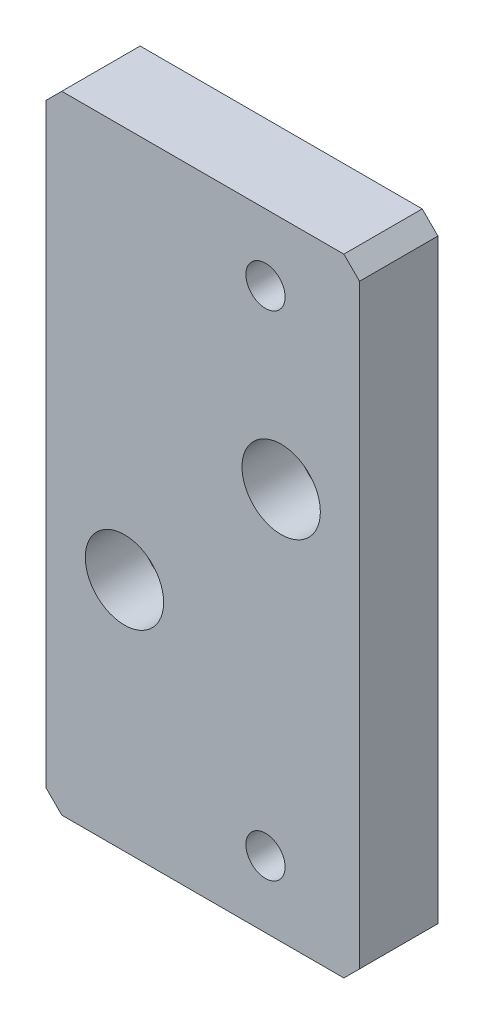
ISO-10303-21;
HEADER;
FILE_DESCRIPTION(('STEP AP214'),'2;1');
FILE_NAME('part.step','',(''),(''),'','','');
FILE_SCHEMA(('AUTOMOTIVE_DESIGN { 1 0 10303 214 1 1 1 1 }'));
ENDSEC;
DATA;
#1=APPLICATION_CONTEXT('core data for automotive mechanical design processes');
#2=APPLICATION_PROTOCOL_DEFINITION('international standard','automotive_design',2000,#1);
#3=PRODUCT_CONTEXT('',#1,'mechanical');
#4=PRODUCT('Part','Part','',(#3));
#5=PRODUCT_RELATED_PRODUCT_CATEGORY('part','',(#4));
#6=PRODUCT_DEFINITION_FORMATION('','',#4);
#7=PRODUCT_DEFINITION_CONTEXT('part definition',#1,'design');
#8=PRODUCT_DEFINITION('design','',#6,#7);
#9=PRODUCT_DEFINITION_SHAPE('','',#8);
#10=(LENGTH_UNIT() NAMED_UNIT(*) SI_UNIT(.MILLI.,.METRE.));
#11=(NAMED_UNIT(*) PLANE_ANGLE_UNIT() SI_UNIT($,.RADIAN.));
#12=(NAMED_UNIT(*) SI_UNIT($,.STERADIAN.) SOLID_ANGLE_UNIT());
#13=UNCERTAINTY_MEASURE_WITH_UNIT(LENGTH_MEASURE(1.E-05),#10,'distance_accuracy_value','');
#14=(GEOMETRIC_REPRESENTATION_CONTEXT(3) GLOBAL_UNCERTAINTY_ASSIGNED_CONTEXT((#13)) GLOBAL_UNIT_ASSIGNED_CONTEXT((#10,
#11,#12)) REPRESENTATION_CONTEXT('',''));
#15=CARTESIAN_POINT('',(0.,0.,0.));
#16=DIRECTION('',(0.,0.,1.));
#17=DIRECTION('',(1.,0.,0.));
#18=AXIS2_PLACEMENT_3D('',#15,#16,#17);
#19=CARTESIAN_POINT('',(-20.,40.,10.));
#20=DIRECTION('',(1.,0.,0.));
#21=DIRECTION('',(0.,1.,0.));
#22=AXIS2_PLACEMENT_3D('',#19,#20,#21);
#23=PLANE('',#22);
#24=DIRECTION('',(0.,-1.,0.));
#25=VECTOR('',#24,1.);
#26=CARTESIAN_POINT('',(-20.,40.,0.));
#27=LINE('',#26,#25);
#28=CARTESIAN_POINT('',(-20.,38.,0.));
#29=VERTEX_POINT('',#28);
#30=CARTESIAN_POINT('',(-20.,-38.,0.));
#31=VERTEX_POINT('',#30);
#32=EDGE_CURVE('E130',#29,#31,#27,.T.);
#33=ORIENTED_EDGE('',*,*,#32,.T.);
#34=DIRECTION('',(0.,0.,1.));
#35=VECTOR('',#34,1.);
#36=CARTESIAN_POINT('',(-20.,-38.,10.));
#37=LINE('',#36,#35);
#38=CARTESIAN_POINT('',(-20.,-38.,10.));
#39=VERTEX_POINT('',#38);
#40=EDGE_CURVE('E108',#31,#39,#37,.T.);
#41=ORIENTED_EDGE('',*,*,#40,.T.);
#42=DIRECTION('',(0.,-1.,0.));
#43=VECTOR('',#42,1.);
#44=CARTESIAN_POINT('',(-20.,40.,10.));
#45=LINE('',#44,#43);
#46=CARTESIAN_POINT('',(-20.,38.,10.));
#47=VERTEX_POINT('',#46);
#48=EDGE_CURVE('E140',#47,#39,#45,.T.);
#49=ORIENTED_EDGE('',*,*,#48,.F.);
#50=DIRECTION('',(0.,0.,-1.));
#51=VECTOR('',#50,1.);
#52=CARTESIAN_POINT('',(-20.,38.,10.));
#53=LINE('',#52,#51);
#54=EDGE_CURVE('E113',#47,#29,#53,.T.);
#55=ORIENTED_EDGE('',*,*,#54,.T.);
#56=EDGE_LOOP('',(#33,#41,#49,#55));
#57=FACE_BOUND('',#56,.T.);
#58=ADVANCED_FACE('F38',(#57),#23,.F.);
#59=CARTESIAN_POINT('',(20.,-40.,10.));
#60=DIRECTION('',(0.,1.,0.));
#61=DIRECTION('',(-1.,0.,0.));
#62=AXIS2_PLACEMENT_3D('',#59,#60,#61);
#63=PLANE('',#62);
#64=DIRECTION('',(1.,0.,0.));
#65=VECTOR('',#64,1.);
#66=CARTESIAN_POINT('',(20.,-40.,10.));
#67=LINE('',#66,#65);
#68=CARTESIAN_POINT('',(-18.,-40.,10.));
#69=VERTEX_POINT('',#68);
#70=CARTESIAN_POINT('',(18.,-40.,10.));
#71=VERTEX_POINT('',#70);
#72=EDGE_CURVE('E123',#69,#71,#67,.T.);
#73=ORIENTED_EDGE('',*,*,#72,.F.);
#74=DIRECTION('',(0.,0.,-1.));
#75=VECTOR('',#74,1.);
#76=CARTESIAN_POINT('',(-18.,-40.,10.));
#77=LINE('',#76,#75);
#78=CARTESIAN_POINT('',(-18.,-40.,0.));
#79=VERTEX_POINT('',#78);
#80=EDGE_CURVE('E107',#69,#79,#77,.T.);
#81=ORIENTED_EDGE('',*,*,#80,.T.);
#82=DIRECTION('',(1.,0.,0.));
#83=VECTOR('',#82,1.);
#84=CARTESIAN_POINT('',(20.,-40.,0.));
#85=LINE('',#84,#83);
#86=CARTESIAN_POINT('',(18.,-40.,0.));
#87=VERTEX_POINT('',#86);
#88=EDGE_CURVE('E120',#79,#87,#85,.T.);
#89=ORIENTED_EDGE('',*,*,#88,.T.);
#90=DIRECTION('',(0.,0.,1.));
#91=VECTOR('',#90,1.);
#92=CARTESIAN_POINT('',(18.,-40.,10.));
#93=LINE('',#92,#91);
#94=EDGE_CURVE('E125',#87,#71,#93,.T.);
#95=ORIENTED_EDGE('',*,*,#94,.T.);
#96=EDGE_LOOP('',(#73,#81,#89,#95));
#97=FACE_BOUND('',#96,.T.);
#98=ADVANCED_FACE('F119',(#97),#63,.F.);
#99=CARTESIAN_POINT('',(20.,40.,10.));
#100=DIRECTION('',(-1.,0.,0.));
#101=DIRECTION('',(0.,-1.,0.));
#102=AXIS2_PLACEMENT_3D('',#99,#100,#101);
#103=PLANE('',#102);
#104=DIRECTION('',(0.,1.,0.));
#105=VECTOR('',#104,1.);
#106=CARTESIAN_POINT('',(20.,40.,10.));
#107=LINE('',#106,#105);
#108=CARTESIAN_POINT('',(20.,-38.,10.));
#109=VERTEX_POINT('',#108);
#110=CARTESIAN_POINT('',(20.,38.,10.));
#111=VERTEX_POINT('',#110);
#112=EDGE_CURVE('E174',#109,#111,#107,.T.);
#113=ORIENTED_EDGE('',*,*,#112,.F.);
#114=DIRECTION('',(0.,0.,-1.));
#115=VECTOR('',#114,1.);
#116=CARTESIAN_POINT('',(20.,-38.,10.));
#117=LINE('',#116,#115);
#118=CARTESIAN_POINT('',(20.,-38.,0.));
#119=VERTEX_POINT('',#118);
#120=EDGE_CURVE('E159',#109,#119,#117,.T.);
#121=ORIENTED_EDGE('',*,*,#120,.T.);
#122=DIRECTION('',(0.,1.,0.));
#123=VECTOR('',#122,1.);
#124=CARTESIAN_POINT('',(20.,40.,0.));
#125=LINE('',#124,#123);
#126=CARTESIAN_POINT('',(20.,38.,0.));
#127=VERTEX_POINT('',#126);
#128=EDGE_CURVE('E129',#119,#127,#125,.T.);
#129=ORIENTED_EDGE('',*,*,#128,.T.);
#130=DIRECTION('',(0.,0.,1.));
#131=VECTOR('',#130,1.);
#132=CARTESIAN_POINT('',(20.,38.,10.));
#133=LINE('',#132,#131);
#134=EDGE_CURVE('E157',#127,#111,#133,.T.);
#135=ORIENTED_EDGE('',*,*,#134,.T.);
#136=EDGE_LOOP('',(#113,#121,#129,#135));
#137=FACE_BOUND('',#136,.T.);
#138=ADVANCED_FACE('F189',(#137),#103,.F.);
#139=CARTESIAN_POINT('',(20.,40.,10.));
#140=DIRECTION('',(0.,-1.,0.));
#141=DIRECTION('',(0.,0.,-1.));
#142=AXIS2_PLACEMENT_3D('',#139,#140,#141);
#143=PLANE('',#142);
#144=DIRECTION('',(-1.,0.,0.));
#145=VECTOR('',#144,1.);
#146=CARTESIAN_POINT('',(20.,40.,0.));
#147=LINE('',#146,#145);
#148=CARTESIAN_POINT('',(18.,40.,0.));
#149=VERTEX_POINT('',#148);
#150=CARTESIAN_POINT('',(-18.,40.,0.));
#151=VERTEX_POINT('',#150);
#152=EDGE_CURVE('E133',#149,#151,#147,.T.);
#153=ORIENTED_EDGE('',*,*,#152,.T.);
#154=DIRECTION('',(0.,0.,1.));
#155=VECTOR('',#154,1.);
#156=CARTESIAN_POINT('',(-18.,40.,10.));
#157=LINE('',#156,#155);
#158=CARTESIAN_POINT('',(-18.,40.,10.));
#159=VERTEX_POINT('',#158);
#160=EDGE_CURVE('E11',#151,#159,#157,.T.);
#161=ORIENTED_EDGE('',*,*,#160,.T.);
#162=DIRECTION('',(-1.,0.,0.));
#163=VECTOR('',#162,1.);
#164=CARTESIAN_POINT('',(20.,40.,10.));
#165=LINE('',#164,#163);
#166=CARTESIAN_POINT('',(18.,40.,10.));
#167=VERTEX_POINT('',#166);
#168=EDGE_CURVE('E141',#167,#159,#165,.T.);
#169=ORIENTED_EDGE('',*,*,#168,.F.);
#170=DIRECTION('',(0.,0.,-1.));
#171=VECTOR('',#170,1.);
#172=CARTESIAN_POINT('',(18.,40.,10.));
#173=LINE('',#172,#171);
#174=EDGE_CURVE('E46',#167,#149,#173,.T.);
#175=ORIENTED_EDGE('',*,*,#174,.T.);
#176=EDGE_LOOP('',(#153,#161,#169,#175));
#177=FACE_BOUND('',#176,.T.);
#178=ADVANCED_FACE('F164',(#177),#143,.F.);
#179=CARTESIAN_POINT('',(0.,0.,10.));
#180=DIRECTION('',(0.,0.,-1.));
#181=DIRECTION('',(-1.,0.,0.));
#182=AXIS2_PLACEMENT_3D('',#179,#180,#181);
#183=PLANE('',#182);
#184=CARTESIAN_POINT('',(9.99999999999414,10.0000000000004,10.));
#185=DIRECTION('',(0.,0.,1.));
#186=DIRECTION('',(1.,0.,0.));
#187=AXIS2_PLACEMENT_3D('',#184,#185,#186);
#188=CIRCLE('',#187,5.);
#189=CARTESIAN_POINT('',(14.9999999999941,10.0000000000004,10.));
#190=VERTEX_POINT('',#189);
#191=EDGE_CURVE('E347',#190,#190,#188,.T.);
#192=ORIENTED_EDGE('',*,*,#191,.F.);
#193=EDGE_LOOP('',(#192));
#194=FACE_BOUND('',#193,.T.);
#195=CARTESIAN_POINT('',(-10.0000000000058,-9.99999999999964,10.));
#196=DIRECTION('',(0.,0.,1.));
#197=DIRECTION('',(1.,0.,0.));
#198=AXIS2_PLACEMENT_3D('',#195,#196,#197);
#199=CIRCLE('',#198,5.);
#200=CARTESIAN_POINT('',(-5.00000000000584,-9.99999999999964,10.));
#201=VERTEX_POINT('',#200);
#202=EDGE_CURVE('E357',#201,#201,#199,.T.);
#203=ORIENTED_EDGE('',*,*,#202,.F.);
#204=EDGE_LOOP('',(#203));
#205=FACE_BOUND('',#204,.T.);
#206=CARTESIAN_POINT('',(7.99999999999975,31.5000000000028,10.));
#207=DIRECTION('',(0.,0.,1.));
#208=DIRECTION('',(1.,0.,0.));
#209=AXIS2_PLACEMENT_3D('',#206,#207,#208);
#210=CIRCLE('',#209,2.5);
#211=CARTESIAN_POINT('',(10.4999999999997,31.5000000000028,10.));
#212=VERTEX_POINT('',#211);
#213=EDGE_CURVE('E369',#212,#212,#210,.T.);
#214=ORIENTED_EDGE('',*,*,#213,.F.);
#215=EDGE_LOOP('',(#214));
#216=FACE_BOUND('',#215,.T.);
#217=CARTESIAN_POINT('',(7.99999999999916,-31.4999999999972,10.));
#218=DIRECTION('',(0.,0.,1.));
#219=DIRECTION('',(1.,0.,0.));
#220=AXIS2_PLACEMENT_3D('',#217,#218,#219);
#221=CIRCLE('',#220,2.5);
#222=CARTESIAN_POINT('',(10.4999999999992,-31.4999999999972,10.));
#223=VERTEX_POINT('',#222);
#224=EDGE_CURVE('E374',#223,#223,#221,.T.);
#225=ORIENTED_EDGE('',*,*,#224,.F.);
#226=EDGE_LOOP('',(#225));
#227=FACE_BOUND('',#226,.T.);
#228=ORIENTED_EDGE('',*,*,#48,.T.);
#229=DIRECTION('',(-0.707106781186547,0.707106781186548,0.));
#230=VECTOR('',#229,1.);
#231=CARTESIAN_POINT('',(-18.,-40.,10.));
#232=LINE('',#231,#230);
#233=EDGE_CURVE('E155',#39,#69,#232,.F.);
#234=ORIENTED_EDGE('',*,*,#233,.T.);
#235=ORIENTED_EDGE('',*,*,#72,.T.);
#236=DIRECTION('',(-0.707106781186548,-0.707106781186548,0.));
#237=VECTOR('',#236,1.);
#238=CARTESIAN_POINT('',(20.,-38.,10.));
#239=LINE('',#238,#237);
#240=EDGE_CURVE('E153',#71,#109,#239,.F.);
#241=ORIENTED_EDGE('',*,*,#240,.T.);
#242=ORIENTED_EDGE('',*,*,#112,.T.);
#243=DIRECTION('',(0.707106781186548,-0.707106781186548,0.));
#244=VECTOR('',#243,1.);
#245=CARTESIAN_POINT('',(18.,40.,10.));
#246=LINE('',#245,#244);
#247=EDGE_CURVE('E58',#111,#167,#246,.F.);
#248=ORIENTED_EDGE('',*,*,#247,.T.);
#249=ORIENTED_EDGE('',*,*,#168,.T.);
#250=DIRECTION('',(0.707106781186548,0.707106781186548,0.));
#251=VECTOR('',#250,1.);
#252=CARTESIAN_POINT('',(-20.,38.,10.));
#253=LINE('',#252,#251);
#254=EDGE_CURVE('E151',#159,#47,#253,.F.);
#255=ORIENTED_EDGE('',*,*,#254,.T.);
#256=EDGE_LOOP('',(#228,#234,#235,#241,#242,#248,#249,#255));
#257=FACE_BOUND('',#256,.T.);
#258=ADVANCED_FACE('F179',(#194,#205,#216,#227,#257),#183,.F.);
#259=CARTESIAN_POINT('',(0.,0.,0.));
#260=DIRECTION('',(0.,0.,-1.));
#261=DIRECTION('',(-1.,0.,0.));
#262=AXIS2_PLACEMENT_3D('',#259,#260,#261);
#263=PLANE('',#262);
#264=CARTESIAN_POINT('',(9.99999999999414,10.0000000000004,0.));
#265=DIRECTION('',(0.,0.,1.));
#266=DIRECTION('',(1.,0.,0.));
#267=AXIS2_PLACEMENT_3D('',#264,#265,#266);
#268=CIRCLE('',#267,2.75);
#269=CARTESIAN_POINT('',(12.7499999999941,10.0000000000004,0.));
#270=VERTEX_POINT('',#269);
#271=EDGE_CURVE('E354',#270,#270,#268,.T.);
#272=ORIENTED_EDGE('',*,*,#271,.T.);
#273=EDGE_LOOP('',(#272));
#274=FACE_BOUND('',#273,.T.);
#275=CARTESIAN_POINT('',(-10.0000000000058,-9.99999999999964,0.));
#276=DIRECTION('',(0.,0.,1.));
#277=DIRECTION('',(1.,0.,0.));
#278=AXIS2_PLACEMENT_3D('',#275,#276,#277);
#279=CIRCLE('',#278,2.75);
#280=CARTESIAN_POINT('',(-7.25000000000584,-9.99999999999964,0.));
#281=VERTEX_POINT('',#280);
#282=EDGE_CURVE('E366',#281,#281,#279,.T.);
#283=ORIENTED_EDGE('',*,*,#282,.T.);
#284=EDGE_LOOP('',(#283));
#285=FACE_BOUND('',#284,.T.);
#286=CARTESIAN_POINT('',(7.99999999999975,31.5000000000028,0.));
#287=DIRECTION('',(0.,0.,1.));
#288=DIRECTION('',(1.,0.,0.));
#289=AXIS2_PLACEMENT_3D('',#286,#287,#288);
#290=CIRCLE('',#289,2.5);
#291=CARTESIAN_POINT('',(10.4999999999997,31.5000000000028,0.));
#292=VERTEX_POINT('',#291);
#293=EDGE_CURVE('E372',#292,#292,#290,.T.);
#294=ORIENTED_EDGE('',*,*,#293,.T.);
#295=EDGE_LOOP('',(#294));
#296=FACE_BOUND('',#295,.T.);
#297=CARTESIAN_POINT('',(7.99999999999916,-31.4999999999972,0.));
#298=DIRECTION('',(0.,0.,1.));
#299=DIRECTION('',(1.,0.,0.));
#300=AXIS2_PLACEMENT_3D('',#297,#298,#299);
#301=CIRCLE('',#300,2.5);
#302=CARTESIAN_POINT('',(10.4999999999992,-31.4999999999972,0.));
#303=VERTEX_POINT('',#302);
#304=EDGE_CURVE('E135',#303,#303,#301,.T.);
#305=ORIENTED_EDGE('',*,*,#304,.T.);
#306=EDGE_LOOP('',(#305));
#307=FACE_BOUND('',#306,.T.);
#308=ORIENTED_EDGE('',*,*,#88,.F.);
#309=DIRECTION('',(0.707106781186547,-0.707106781186548,0.));
#310=VECTOR('',#309,1.);
#311=CARTESIAN_POINT('',(-29.,-29.,0.));
#312=LINE('',#311,#310);
#313=EDGE_CURVE('E103',#79,#31,#312,.F.);
#314=ORIENTED_EDGE('',*,*,#313,.T.);
#315=ORIENTED_EDGE('',*,*,#32,.F.);
#316=DIRECTION('',(-0.707106781186548,-0.707106781186548,0.));
#317=VECTOR('',#316,1.);
#318=CARTESIAN_POINT('',(-29.,29.,0.));
#319=LINE('',#318,#317);
#320=EDGE_CURVE('E144',#29,#151,#319,.F.);
#321=ORIENTED_EDGE('',*,*,#320,.T.);
#322=ORIENTED_EDGE('',*,*,#152,.F.);
#323=DIRECTION('',(-0.707106781186548,0.707106781186548,0.));
#324=VECTOR('',#323,1.);
#325=CARTESIAN_POINT('',(29.,29.,0.));
#326=LINE('',#325,#324);
#327=EDGE_CURVE('E124',#149,#127,#326,.F.);
#328=ORIENTED_EDGE('',*,*,#327,.T.);
#329=ORIENTED_EDGE('',*,*,#128,.F.);
#330=DIRECTION('',(0.707106781186548,0.707106781186548,0.));
#331=VECTOR('',#330,1.);
#332=CARTESIAN_POINT('',(29.,-29.,0.));
#333=LINE('',#332,#331);
#334=EDGE_CURVE('E114',#119,#87,#333,.F.);
#335=ORIENTED_EDGE('',*,*,#334,.T.);
#336=EDGE_LOOP('',(#308,#314,#315,#321,#322,#328,#329,#335));
#337=FACE_BOUND('',#336,.T.);
#338=ADVANCED_FACE('F127',(#274,#285,#296,#307,#337),#263,.T.);
#339=CARTESIAN_POINT('',(-18.,-40.,10.));
#340=DIRECTION('',(0.707106781186548,0.707106781186547,0.));
#341=DIRECTION('',(0.,0.,-1.));
#342=AXIS2_PLACEMENT_3D('',#339,#340,#341);
#343=PLANE('',#342);
#344=ORIENTED_EDGE('',*,*,#233,.F.);
#345=ORIENTED_EDGE('',*,*,#40,.F.);
#346=ORIENTED_EDGE('',*,*,#313,.F.);
#347=ORIENTED_EDGE('',*,*,#80,.F.);
#348=EDGE_LOOP('',(#344,#345,#346,#347));
#349=FACE_BOUND('',#348,.T.);
#350=ADVANCED_FACE('F106',(#349),#343,.F.);
#351=CARTESIAN_POINT('',(20.,-38.,10.));
#352=DIRECTION('',(-0.707106781186547,0.707106781186547,0.));
#353=DIRECTION('',(0.,0.,-1.));
#354=AXIS2_PLACEMENT_3D('',#351,#352,#353);
#355=PLANE('',#354);
#356=ORIENTED_EDGE('',*,*,#240,.F.);
#357=ORIENTED_EDGE('',*,*,#94,.F.);
#358=ORIENTED_EDGE('',*,*,#334,.F.);
#359=ORIENTED_EDGE('',*,*,#120,.F.);
#360=EDGE_LOOP('',(#356,#357,#358,#359));
#361=FACE_BOUND('',#360,.T.);
#362=ADVANCED_FACE('F204',(#361),#355,.F.);
#363=CARTESIAN_POINT('',(-20.,38.,10.));
#364=DIRECTION('',(0.707106781186547,-0.707106781186547,0.));
#365=DIRECTION('',(0.,0.,-1.));
#366=AXIS2_PLACEMENT_3D('',#363,#364,#365);
#367=PLANE('',#366);
#368=ORIENTED_EDGE('',*,*,#254,.F.);
#369=ORIENTED_EDGE('',*,*,#160,.F.);
#370=ORIENTED_EDGE('',*,*,#320,.F.);
#371=ORIENTED_EDGE('',*,*,#54,.F.);
#372=EDGE_LOOP('',(#368,#369,#370,#371));
#373=FACE_BOUND('',#372,.T.);
#374=ADVANCED_FACE('F169',(#373),#367,.F.);
#375=CARTESIAN_POINT('',(18.,40.,10.));
#376=DIRECTION('',(-0.707106781186547,-0.707106781186547,0.));
#377=DIRECTION('',(0.,0.,-1.));
#378=AXIS2_PLACEMENT_3D('',#375,#376,#377);
#379=PLANE('',#378);
#380=ORIENTED_EDGE('',*,*,#247,.F.);
#381=ORIENTED_EDGE('',*,*,#134,.F.);
#382=ORIENTED_EDGE('',*,*,#327,.F.);
#383=ORIENTED_EDGE('',*,*,#174,.F.);
#384=EDGE_LOOP('',(#380,#381,#382,#383));
#385=FACE_BOUND('',#384,.T.);
#386=ADVANCED_FACE('F40',(#385),#379,.F.);
#387=CARTESIAN_POINT('',(7.99999999999916,-31.4999999999972,10.));
#388=DIRECTION('',(0.,0.,1.));
#389=DIRECTION('',(1.,0.,0.));
#390=AXIS2_PLACEMENT_3D('',#387,#388,#389);
#391=CYLINDRICAL_SURFACE('',#390,2.5);
#392=ORIENTED_EDGE('',*,*,#304,.F.);
#393=EDGE_LOOP('',(#392));
#394=FACE_BOUND('',#393,.T.);
#395=ORIENTED_EDGE('',*,*,#224,.T.);
#396=EDGE_LOOP('',(#395));
#397=FACE_BOUND('',#396,.T.);
#398=ADVANCED_FACE('F211',(#394,#397),#391,.F.);
#399=CARTESIAN_POINT('',(7.99999999999975,31.5000000000028,10.));
#400=DIRECTION('',(0.,0.,1.));
#401=DIRECTION('',(1.,0.,0.));
#402=AXIS2_PLACEMENT_3D('',#399,#400,#401);
#403=CYLINDRICAL_SURFACE('',#402,2.5);
#404=ORIENTED_EDGE('',*,*,#293,.F.);
#405=EDGE_LOOP('',(#404));
#406=FACE_BOUND('',#405,.T.);
#407=ORIENTED_EDGE('',*,*,#213,.T.);
#408=EDGE_LOOP('',(#407));
#409=FACE_BOUND('',#408,.T.);
#410=ADVANCED_FACE('F215',(#406,#409),#403,.F.);
#411=CARTESIAN_POINT('',(-10.0000000000058,-9.99999999999964,10.));
#412=DIRECTION('',(0.,0.,1.));
#413=DIRECTION('',(1.,0.,0.));
#414=AXIS2_PLACEMENT_3D('',#411,#412,#413);
#415=CYLINDRICAL_SURFACE('',#414,2.75);
#416=ORIENTED_EDGE('',*,*,#282,.F.);
#417=EDGE_LOOP('',(#416));
#418=FACE_BOUND('',#417,.T.);
#419=CARTESIAN_POINT('',(-10.0000000000058,-9.99999999999964,3.));
#420=DIRECTION('',(0.,0.,1.));
#421=DIRECTION('',(1.,0.,0.));
#422=AXIS2_PLACEMENT_3D('',#419,#420,#421);
#423=CIRCLE('',#422,2.75);
#424=CARTESIAN_POINT('',(-7.25000000000584,-9.99999999999964,3.));
#425=VERTEX_POINT('',#424);
#426=EDGE_CURVE('E363',#425,#425,#423,.T.);
#427=ORIENTED_EDGE('',*,*,#426,.T.);
#428=EDGE_LOOP('',(#427));
#429=FACE_BOUND('',#428,.T.);
#430=ADVANCED_FACE('F269',(#418,#429),#415,.F.);
#431=CARTESIAN_POINT('',(-7.25000000000584,-9.99999999999964,3.));
#432=DIRECTION('',(0.,0.,-1.));
#433=DIRECTION('',(-1.,0.,0.));
#434=AXIS2_PLACEMENT_3D('',#431,#432,#433);
#435=PLANE('',#434);
#436=ORIENTED_EDGE('',*,*,#426,.F.);
#437=EDGE_LOOP('',(#436));
#438=FACE_BOUND('',#437,.T.);
#439=CARTESIAN_POINT('',(-10.0000000000058,-9.99999999999964,3.));
#440=DIRECTION('',(0.,0.,1.));
#441=DIRECTION('',(1.,0.,0.));
#442=AXIS2_PLACEMENT_3D('',#439,#440,#441);
#443=CIRCLE('',#442,5.);
#444=CARTESIAN_POINT('',(-5.00000000000584,-9.99999999999964,3.));
#445=VERTEX_POINT('',#444);
#446=EDGE_CURVE('E360',#445,#445,#443,.T.);
#447=ORIENTED_EDGE('',*,*,#446,.T.);
#448=EDGE_LOOP('',(#447));
#449=FACE_BOUND('',#448,.T.);
#450=ADVANCED_FACE('F288',(#438,#449),#435,.F.);
#451=CARTESIAN_POINT('',(-10.0000000000058,-9.99999999999964,10.));
#452=DIRECTION('',(0.,0.,1.));
#453=DIRECTION('',(1.,0.,0.));
#454=AXIS2_PLACEMENT_3D('',#451,#452,#453);
#455=CYLINDRICAL_SURFACE('',#454,5.);
#456=ORIENTED_EDGE('',*,*,#446,.F.);
#457=EDGE_LOOP('',(#456));
#458=FACE_BOUND('',#457,.T.);
#459=ORIENTED_EDGE('',*,*,#202,.T.);
#460=EDGE_LOOP('',(#459));
#461=FACE_BOUND('',#460,.T.);
#462=ADVANCED_FACE('F298',(#458,#461),#455,.F.);
#463=CARTESIAN_POINT('',(9.99999999999414,10.0000000000004,10.));
#464=DIRECTION('',(0.,0.,1.));
#465=DIRECTION('',(1.,0.,0.));
#466=AXIS2_PLACEMENT_3D('',#463,#464,#465);
#467=CYLINDRICAL_SURFACE('',#466,2.75);
#468=ORIENTED_EDGE('',*,*,#271,.F.);
#469=EDGE_LOOP('',(#468));
#470=FACE_BOUND('',#469,.T.);
#471=CARTESIAN_POINT('',(9.99999999999414,10.0000000000004,3.));
#472=DIRECTION('',(0.,0.,1.));
#473=DIRECTION('',(1.,0.,0.));
#474=AXIS2_PLACEMENT_3D('',#471,#472,#473);
#475=CIRCLE('',#474,2.75);
#476=CARTESIAN_POINT('',(12.7499999999941,10.0000000000004,3.));
#477=VERTEX_POINT('',#476);
#478=EDGE_CURVE('E349',#477,#477,#475,.T.);
#479=ORIENTED_EDGE('',*,*,#478,.T.);
#480=EDGE_LOOP('',(#479));
#481=FACE_BOUND('',#480,.T.);
#482=ADVANCED_FACE('F308',(#470,#481),#467,.F.);
#483=CARTESIAN_POINT('',(12.7499999999941,10.0000000000004,3.));
#484=DIRECTION('',(0.,0.,-1.));
#485=DIRECTION('',(-1.,0.,0.));
#486=AXIS2_PLACEMENT_3D('',#483,#484,#485);
#487=PLANE('',#486);
#488=ORIENTED_EDGE('',*,*,#478,.F.);
#489=EDGE_LOOP('',(#488));
#490=FACE_BOUND('',#489,.T.);
#491=CARTESIAN_POINT('',(9.99999999999414,10.0000000000004,3.));
#492=DIRECTION('',(0.,0.,1.));
#493=DIRECTION('',(1.,0.,0.));
#494=AXIS2_PLACEMENT_3D('',#491,#492,#493);
#495=CIRCLE('',#494,5.);
#496=CARTESIAN_POINT('',(14.9999999999941,10.0000000000004,3.));
#497=VERTEX_POINT('',#496);
#498=EDGE_CURVE('E345',#497,#497,#495,.T.);
#499=ORIENTED_EDGE('',*,*,#498,.T.);
#500=EDGE_LOOP('',(#499));
#501=FACE_BOUND('',#500,.T.);
#502=ADVANCED_FACE('F318',(#490,#501),#487,.F.);
#503=CARTESIAN_POINT('',(9.99999999999414,10.0000000000004,10.));
#504=DIRECTION('',(0.,0.,1.));
#505=DIRECTION('',(1.,0.,0.));
#506=AXIS2_PLACEMENT_3D('',#503,#504,#505);
#507=CYLINDRICAL_SURFACE('',#506,5.);
#508=ORIENTED_EDGE('',*,*,#498,.F.);
#509=EDGE_LOOP('',(#508));
#510=FACE_BOUND('',#509,.T.);
#511=ORIENTED_EDGE('',*,*,#191,.T.);
#512=EDGE_LOOP('',(#511));
#513=FACE_BOUND('',#512,.T.);
#514=ADVANCED_FACE('F328',(#510,#513),#507,.F.);
#515=CLOSED_SHELL('',(#58,#98,#138,#178,#258,#338,#350,#362,#374,#386,#398,#410,#430,#450,#462,
#482,#502,#514));
#516=MANIFOLD_SOLID_BREP('B2',#515);
#517=ADVANCED_BREP_SHAPE_REPRESENTATION('',(#18,#516),#14);
#518=SHAPE_DEFINITION_REPRESENTATION(#9,#517);
ENDSEC;
END-ISO-10303-21;
